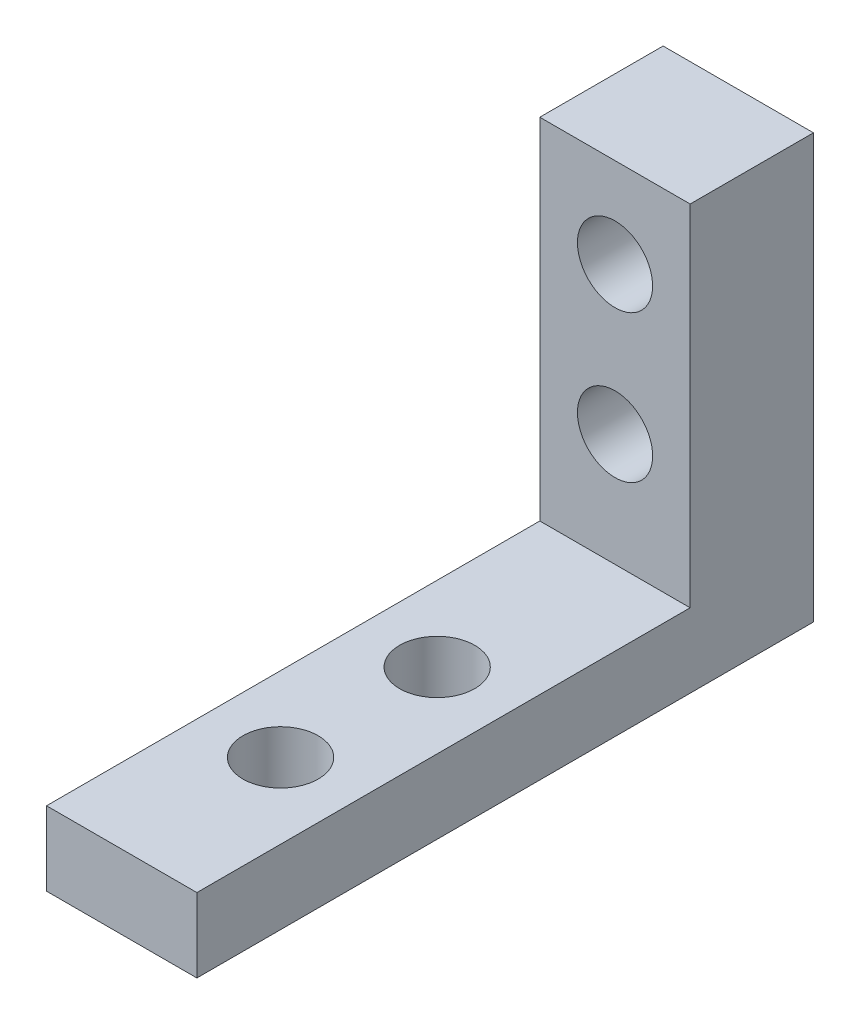
ISO-10303-21;
HEADER;
FILE_DESCRIPTION(('STEP AP214'),'2;1');
FILE_NAME('part.step','',(''),(''),'','','');
FILE_SCHEMA(('AUTOMOTIVE_DESIGN { 1 0 10303 214 1 1 1 1 }'));
ENDSEC;
DATA;
#1=APPLICATION_CONTEXT('core data for automotive mechanical design processes');
#2=APPLICATION_PROTOCOL_DEFINITION('international standard','automotive_design',2000,#1);
#3=PRODUCT_CONTEXT('',#1,'mechanical');
#4=PRODUCT('Part','Part','',(#3));
#5=PRODUCT_RELATED_PRODUCT_CATEGORY('part','',(#4));
#6=PRODUCT_DEFINITION_FORMATION('','',#4);
#7=PRODUCT_DEFINITION_CONTEXT('part definition',#1,'design');
#8=PRODUCT_DEFINITION('design','',#6,#7);
#9=PRODUCT_DEFINITION_SHAPE('','',#8);
#10=(LENGTH_UNIT() NAMED_UNIT(*) SI_UNIT(.MILLI.,.METRE.));
#11=(NAMED_UNIT(*) PLANE_ANGLE_UNIT() SI_UNIT($,.RADIAN.));
#12=(NAMED_UNIT(*) SI_UNIT($,.STERADIAN.) SOLID_ANGLE_UNIT());
#13=UNCERTAINTY_MEASURE_WITH_UNIT(LENGTH_MEASURE(1.E-05),#10,'distance_accuracy_value','');
#14=(GEOMETRIC_REPRESENTATION_CONTEXT(3) GLOBAL_UNCERTAINTY_ASSIGNED_CONTEXT((#13)) GLOBAL_UNIT_ASSIGNED_CONTEXT((#10,
#11,#12)) REPRESENTATION_CONTEXT('',''));
#15=CARTESIAN_POINT('',(0.,0.,0.));
#16=DIRECTION('',(0.,0.,1.));
#17=DIRECTION('',(1.,0.,0.));
#18=AXIS2_PLACEMENT_3D('',#15,#16,#17);
#19=CARTESIAN_POINT('',(6.096,0.,0.));
#20=DIRECTION('',(0.,-1.,0.));
#21=DIRECTION('',(0.,0.,-1.));
#22=AXIS2_PLACEMENT_3D('',#19,#20,#21);
#23=PLANE('',#22);
#24=CARTESIAN_POINT('',(3.046,0.,7.20682176459735));
#25=DIRECTION('',(0.,1.,0.));
#26=DIRECTION('',(0.,0.,1.));
#27=AXIS2_PLACEMENT_3D('',#24,#25,#26);
#28=CIRCLE('',#27,1.524);
#29=CARTESIAN_POINT('',(3.046,0.,8.73082176459736));
#30=VERTEX_POINT('',#29);
#31=EDGE_CURVE('E210',#30,#30,#28,.T.);
#32=ORIENTED_EDGE('',*,*,#31,.F.);
#33=EDGE_LOOP('',(#32));
#34=FACE_BOUND('',#33,.T.);
#35=CARTESIAN_POINT('',(3.046,0.,13.5568217645974));
#36=DIRECTION('',(0.,1.,0.));
#37=DIRECTION('',(0.,0.,1.));
#38=AXIS2_PLACEMENT_3D('',#35,#36,#37);
#39=CIRCLE('',#38,1.525);
#40=CARTESIAN_POINT('',(3.046,0.,15.0818217645974));
#41=VERTEX_POINT('',#40);
#42=EDGE_CURVE('E174',#41,#41,#39,.T.);
#43=ORIENTED_EDGE('',*,*,#42,.F.);
#44=EDGE_LOOP('',(#43));
#45=FACE_BOUND('',#44,.T.);
#46=DIRECTION('',(0.,0.,1.));
#47=VECTOR('',#46,1.);
#48=CARTESIAN_POINT('',(0.,0.,0.));
#49=LINE('',#48,#47);
#50=CARTESIAN_POINT('',(0.,0.,0.));
#51=VERTEX_POINT('',#50);
#52=CARTESIAN_POINT('',(0.,0.,20.));
#53=VERTEX_POINT('',#52);
#54=EDGE_CURVE('E130',#51,#53,#49,.T.);
#55=ORIENTED_EDGE('',*,*,#54,.T.);
#56=DIRECTION('',(-1.,0.,0.));
#57=VECTOR('',#56,1.);
#58=CARTESIAN_POINT('',(6.096,0.,20.));
#59=LINE('',#58,#57);
#60=CARTESIAN_POINT('',(6.096,0.,20.));
#61=VERTEX_POINT('',#60);
#62=EDGE_CURVE('E11',#61,#53,#59,.T.);
#63=ORIENTED_EDGE('',*,*,#62,.F.);
#64=DIRECTION('',(0.,0.,1.));
#65=VECTOR('',#64,1.);
#66=CARTESIAN_POINT('',(6.096,0.,0.));
#67=LINE('',#66,#65);
#68=CARTESIAN_POINT('',(6.096,0.,0.));
#69=VERTEX_POINT('',#68);
#70=EDGE_CURVE('E146',#69,#61,#67,.T.);
#71=ORIENTED_EDGE('',*,*,#70,.F.);
#72=DIRECTION('',(-1.,0.,0.));
#73=VECTOR('',#72,1.);
#74=CARTESIAN_POINT('',(6.096,0.,0.));
#75=LINE('',#74,#73);
#76=EDGE_CURVE('E126',#69,#51,#75,.T.);
#77=ORIENTED_EDGE('',*,*,#76,.T.);
#78=EDGE_LOOP('',(#55,#63,#71,#77));
#79=FACE_BOUND('',#78,.T.);
#80=ADVANCED_FACE('F39',(#34,#45,#79),#23,.F.);
#81=CARTESIAN_POINT('',(6.096,0.,20.));
#82=DIRECTION('',(0.,0.,-1.));
#83=DIRECTION('',(-1.,0.,0.));
#84=AXIS2_PLACEMENT_3D('',#81,#82,#83);
#85=PLANE('',#84);
#86=DIRECTION('',(0.,-1.,0.));
#87=VECTOR('',#86,1.);
#88=CARTESIAN_POINT('',(0.,0.,20.));
#89=LINE('',#88,#87);
#90=CARTESIAN_POINT('',(0.,-3.,20.));
#91=VERTEX_POINT('',#90);
#92=EDGE_CURVE('E134',#53,#91,#89,.T.);
#93=ORIENTED_EDGE('',*,*,#92,.T.);
#94=DIRECTION('',(-1.,0.,0.));
#95=VECTOR('',#94,1.);
#96=CARTESIAN_POINT('',(6.096,-3.,20.));
#97=LINE('',#96,#95);
#98=CARTESIAN_POINT('',(6.096,-3.,20.));
#99=VERTEX_POINT('',#98);
#100=EDGE_CURVE('E49',#99,#91,#97,.T.);
#101=ORIENTED_EDGE('',*,*,#100,.F.);
#102=DIRECTION('',(0.,-1.,0.));
#103=VECTOR('',#102,1.);
#104=CARTESIAN_POINT('',(6.096,0.,20.));
#105=LINE('',#104,#103);
#106=EDGE_CURVE('E95',#61,#99,#105,.T.);
#107=ORIENTED_EDGE('',*,*,#106,.F.);
#108=ORIENTED_EDGE('',*,*,#62,.T.);
#109=EDGE_LOOP('',(#93,#101,#107,#108));
#110=FACE_BOUND('',#109,.T.);
#111=ADVANCED_FACE('F183',(#110),#85,.F.);
#112=CARTESIAN_POINT('',(6.096,-3.,-5.));
#113=DIRECTION('',(0.,1.,0.));
#114=DIRECTION('',(0.,0.,1.));
#115=AXIS2_PLACEMENT_3D('',#112,#113,#114);
#116=PLANE('',#115);
#117=CARTESIAN_POINT('',(3.046,-3.,7.20682176459735));
#118=DIRECTION('',(0.,1.,0.));
#119=DIRECTION('',(0.,0.,1.));
#120=AXIS2_PLACEMENT_3D('',#117,#118,#119);
#121=CIRCLE('',#120,1.524);
#122=CARTESIAN_POINT('',(3.046,-3.,8.73082176459736));
#123=VERTEX_POINT('',#122);
#124=EDGE_CURVE('E171',#123,#123,#121,.T.);
#125=ORIENTED_EDGE('',*,*,#124,.T.);
#126=EDGE_LOOP('',(#125));
#127=FACE_BOUND('',#126,.T.);
#128=CARTESIAN_POINT('',(3.046,-3.,13.5568217645974));
#129=DIRECTION('',(0.,1.,0.));
#130=DIRECTION('',(0.,0.,1.));
#131=AXIS2_PLACEMENT_3D('',#128,#129,#130);
#132=CIRCLE('',#131,1.525);
#133=CARTESIAN_POINT('',(3.046,-3.,15.0818217645974));
#134=VERTEX_POINT('',#133);
#135=EDGE_CURVE('E215',#134,#134,#132,.T.);
#136=ORIENTED_EDGE('',*,*,#135,.T.);
#137=EDGE_LOOP('',(#136));
#138=FACE_BOUND('',#137,.T.);
#139=DIRECTION('',(0.,0.,-1.));
#140=VECTOR('',#139,1.);
#141=CARTESIAN_POINT('',(0.,-3.,-5.));
#142=LINE('',#141,#140);
#143=CARTESIAN_POINT('',(0.,-3.,-5.));
#144=VERTEX_POINT('',#143);
#145=EDGE_CURVE('E137',#91,#144,#142,.T.);
#146=ORIENTED_EDGE('',*,*,#145,.T.);
#147=DIRECTION('',(-1.,0.,0.));
#148=VECTOR('',#147,1.);
#149=CARTESIAN_POINT('',(6.096,-3.,-5.));
#150=LINE('',#149,#148);
#151=CARTESIAN_POINT('',(6.096,-3.,-5.));
#152=VERTEX_POINT('',#151);
#153=EDGE_CURVE('E119',#152,#144,#150,.T.);
#154=ORIENTED_EDGE('',*,*,#153,.F.);
#155=DIRECTION('',(0.,0.,-1.));
#156=VECTOR('',#155,1.);
#157=CARTESIAN_POINT('',(6.096,-3.,-5.));
#158=LINE('',#157,#156);
#159=EDGE_CURVE('E108',#99,#152,#158,.T.);
#160=ORIENTED_EDGE('',*,*,#159,.F.);
#161=ORIENTED_EDGE('',*,*,#100,.T.);
#162=EDGE_LOOP('',(#146,#154,#160,#161));
#163=FACE_BOUND('',#162,.T.);
#164=ADVANCED_FACE('F186',(#127,#138,#163),#116,.F.);
#165=CARTESIAN_POINT('',(6.096,14.1783216783217,-5.));
#166=DIRECTION('',(0.,0.,1.));
#167=DIRECTION('',(0.,-1.,0.));
#168=AXIS2_PLACEMENT_3D('',#165,#166,#167);
#169=PLANE('',#168);
#170=CARTESIAN_POINT('',(3.05,10.5387202913931,-5.));
#171=DIRECTION('',(0.,0.,-1.));
#172=DIRECTION('',(0.,1.,0.));
#173=AXIS2_PLACEMENT_3D('',#170,#171,#172);
#174=CIRCLE('',#173,1.524);
#175=CARTESIAN_POINT('',(3.05,12.0627202913931,-5.));
#176=VERTEX_POINT('',#175);
#177=EDGE_CURVE('E158',#176,#176,#174,.T.);
#178=ORIENTED_EDGE('',*,*,#177,.F.);
#179=EDGE_LOOP('',(#178));
#180=FACE_BOUND('',#179,.T.);
#181=CARTESIAN_POINT('',(3.05,4.57287286643293,-5.));
#182=DIRECTION('',(0.,0.,-1.));
#183=DIRECTION('',(0.,1.,0.));
#184=AXIS2_PLACEMENT_3D('',#181,#182,#183);
#185=CIRCLE('',#184,1.525);
#186=CARTESIAN_POINT('',(3.05,6.09787286643293,-5.));
#187=VERTEX_POINT('',#186);
#188=EDGE_CURVE('E165',#187,#187,#185,.T.);
#189=ORIENTED_EDGE('',*,*,#188,.F.);
#190=EDGE_LOOP('',(#189));
#191=FACE_BOUND('',#190,.T.);
#192=DIRECTION('',(0.,1.,0.));
#193=VECTOR('',#192,1.);
#194=CARTESIAN_POINT('',(0.,14.1783216783217,-5.));
#195=LINE('',#194,#193);
#196=CARTESIAN_POINT('',(0.,14.1783216783217,-5.));
#197=VERTEX_POINT('',#196);
#198=EDGE_CURVE('E117',#144,#197,#195,.T.);
#199=ORIENTED_EDGE('',*,*,#198,.T.);
#200=DIRECTION('',(-1.,0.,0.));
#201=VECTOR('',#200,1.);
#202=CARTESIAN_POINT('',(6.096,14.1783216783217,-5.));
#203=LINE('',#202,#201);
#204=CARTESIAN_POINT('',(6.096,14.1783216783217,-5.));
#205=VERTEX_POINT('',#204);
#206=EDGE_CURVE('E114',#205,#197,#203,.T.);
#207=ORIENTED_EDGE('',*,*,#206,.F.);
#208=DIRECTION('',(0.,1.,0.));
#209=VECTOR('',#208,1.);
#210=CARTESIAN_POINT('',(6.096,14.1783216783217,-5.));
#211=LINE('',#210,#209);
#212=EDGE_CURVE('E102',#152,#205,#211,.T.);
#213=ORIENTED_EDGE('',*,*,#212,.F.);
#214=ORIENTED_EDGE('',*,*,#153,.T.);
#215=EDGE_LOOP('',(#199,#207,#213,#214));
#216=FACE_BOUND('',#215,.T.);
#217=ADVANCED_FACE('F115',(#180,#191,#216),#169,.F.);
#218=CARTESIAN_POINT('',(6.096,14.1783216783217,0.));
#219=DIRECTION('',(0.,-1.,0.));
#220=DIRECTION('',(0.,0.,-1.));
#221=AXIS2_PLACEMENT_3D('',#218,#219,#220);
#222=PLANE('',#221);
#223=DIRECTION('',(0.,0.,1.));
#224=VECTOR('',#223,1.);
#225=CARTESIAN_POINT('',(0.,14.1783216783217,0.));
#226=LINE('',#225,#224);
#227=CARTESIAN_POINT('',(0.,14.1783216783217,0.));
#228=VERTEX_POINT('',#227);
#229=EDGE_CURVE('E81',#197,#228,#226,.T.);
#230=ORIENTED_EDGE('',*,*,#229,.T.);
#231=DIRECTION('',(-1.,0.,0.));
#232=VECTOR('',#231,1.);
#233=CARTESIAN_POINT('',(6.096,14.1783216783217,0.));
#234=LINE('',#233,#232);
#235=CARTESIAN_POINT('',(6.096,14.1783216783217,0.));
#236=VERTEX_POINT('',#235);
#237=EDGE_CURVE('E120',#236,#228,#234,.T.);
#238=ORIENTED_EDGE('',*,*,#237,.F.);
#239=DIRECTION('',(0.,0.,1.));
#240=VECTOR('',#239,1.);
#241=CARTESIAN_POINT('',(6.096,14.1783216783217,0.));
#242=LINE('',#241,#240);
#243=EDGE_CURVE('E106',#205,#236,#242,.T.);
#244=ORIENTED_EDGE('',*,*,#243,.F.);
#245=ORIENTED_EDGE('',*,*,#206,.T.);
#246=EDGE_LOOP('',(#230,#238,#244,#245));
#247=FACE_BOUND('',#246,.T.);
#248=ADVANCED_FACE('F122',(#247),#222,.F.);
#249=CARTESIAN_POINT('',(6.096,0.,0.));
#250=DIRECTION('',(0.,0.,-1.));
#251=DIRECTION('',(-1.,0.,0.));
#252=AXIS2_PLACEMENT_3D('',#249,#250,#251);
#253=PLANE('',#252);
#254=CARTESIAN_POINT('',(3.05,10.5387202913931,0.));
#255=DIRECTION('',(0.,0.,-1.));
#256=DIRECTION('',(-1.,0.,0.));
#257=AXIS2_PLACEMENT_3D('',#254,#255,#256);
#258=CIRCLE('',#257,1.524);
#259=CARTESIAN_POINT('',(3.05,12.0627202913931,0.));
#260=VERTEX_POINT('',#259);
#261=EDGE_CURVE('E42',#260,#260,#258,.T.);
#262=ORIENTED_EDGE('',*,*,#261,.T.);
#263=EDGE_LOOP('',(#262));
#264=FACE_BOUND('',#263,.T.);
#265=CARTESIAN_POINT('',(3.05,4.57287286643293,0.));
#266=DIRECTION('',(0.,0.,-1.));
#267=DIRECTION('',(-1.,0.,0.));
#268=AXIS2_PLACEMENT_3D('',#265,#266,#267);
#269=CIRCLE('',#268,1.525);
#270=CARTESIAN_POINT('',(3.05,6.09787286643293,0.));
#271=VERTEX_POINT('',#270);
#272=EDGE_CURVE('E155',#271,#271,#269,.T.);
#273=ORIENTED_EDGE('',*,*,#272,.T.);
#274=EDGE_LOOP('',(#273));
#275=FACE_BOUND('',#274,.T.);
#276=DIRECTION('',(0.,-1.,0.));
#277=VECTOR('',#276,1.);
#278=CARTESIAN_POINT('',(0.,0.,0.));
#279=LINE('',#278,#277);
#280=EDGE_CURVE('E87',#228,#51,#279,.T.);
#281=ORIENTED_EDGE('',*,*,#280,.T.);
#282=ORIENTED_EDGE('',*,*,#76,.F.);
#283=DIRECTION('',(0.,-1.,0.));
#284=VECTOR('',#283,1.);
#285=CARTESIAN_POINT('',(6.096,0.,0.));
#286=LINE('',#285,#284);
#287=EDGE_CURVE('E58',#236,#69,#286,.T.);
#288=ORIENTED_EDGE('',*,*,#287,.F.);
#289=ORIENTED_EDGE('',*,*,#237,.T.);
#290=EDGE_LOOP('',(#281,#282,#288,#289));
#291=FACE_BOUND('',#290,.T.);
#292=ADVANCED_FACE('F191',(#264,#275,#291),#253,.F.);
#293=CARTESIAN_POINT('',(6.096,0.,0.));
#294=DIRECTION('',(1.,0.,0.));
#295=DIRECTION('',(0.,0.,-1.));
#296=AXIS2_PLACEMENT_3D('',#293,#294,#295);
#297=PLANE('',#296);
#298=ORIENTED_EDGE('',*,*,#70,.T.);
#299=ORIENTED_EDGE('',*,*,#106,.T.);
#300=ORIENTED_EDGE('',*,*,#159,.T.);
#301=ORIENTED_EDGE('',*,*,#212,.T.);
#302=ORIENTED_EDGE('',*,*,#243,.T.);
#303=ORIENTED_EDGE('',*,*,#287,.T.);
#304=EDGE_LOOP('',(#298,#299,#300,#301,#302,#303));
#305=FACE_BOUND('',#304,.T.);
#306=ADVANCED_FACE('F104',(#305),#297,.T.);
#307=CARTESIAN_POINT('',(0.,0.,0.));
#308=DIRECTION('',(1.,0.,0.));
#309=DIRECTION('',(0.,0.,-1.));
#310=AXIS2_PLACEMENT_3D('',#307,#308,#309);
#311=PLANE('',#310);
#312=ORIENTED_EDGE('',*,*,#54,.F.);
#313=ORIENTED_EDGE('',*,*,#280,.F.);
#314=ORIENTED_EDGE('',*,*,#229,.F.);
#315=ORIENTED_EDGE('',*,*,#198,.F.);
#316=ORIENTED_EDGE('',*,*,#145,.F.);
#317=ORIENTED_EDGE('',*,*,#92,.F.);
#318=EDGE_LOOP('',(#312,#313,#314,#315,#316,#317));
#319=FACE_BOUND('',#318,.T.);
#320=ADVANCED_FACE('F189',(#319),#311,.F.);
#321=CARTESIAN_POINT('',(3.05,4.57287286643293,20.));
#322=DIRECTION('',(0.,0.,-1.));
#323=DIRECTION('',(0.,1.,0.));
#324=AXIS2_PLACEMENT_3D('',#321,#322,#323);
#325=CYLINDRICAL_SURFACE('',#324,1.525);
#326=CARTESIAN_POINT('',(3.05,6.09787286643293,-5.));
#327=CARTESIAN_POINT('',(3.05,6.09787286643293,-4.94791666666667));
#328=CARTESIAN_POINT('',(3.05,6.09787286643293,-4.89583333333333));
#329=CARTESIAN_POINT('',(3.05,6.09787286643293,-4.79166666666667));
#330=CARTESIAN_POINT('',(3.05,6.09787286643293,-4.73958333333333));
#331=CARTESIAN_POINT('',(3.05,6.09787286643293,-4.63541666666667));
#332=CARTESIAN_POINT('',(3.05,6.09787286643293,-4.58333333333333));
#333=CARTESIAN_POINT('',(3.05,6.09787286643293,-4.47916666666667));
#334=CARTESIAN_POINT('',(3.05,6.09787286643293,-4.42708333333333));
#335=CARTESIAN_POINT('',(3.05,6.09787286643293,-4.32291666666667));
#336=CARTESIAN_POINT('',(3.05,6.09787286643293,-4.27083333333333));
#337=CARTESIAN_POINT('',(3.05,6.09787286643293,-4.16666666666667));
#338=CARTESIAN_POINT('',(3.05,6.09787286643293,-4.11458333333333));
#339=CARTESIAN_POINT('',(3.05,6.09787286643293,-4.01041666666667));
#340=CARTESIAN_POINT('',(3.05,6.09787286643293,-3.95833333333333));
#341=CARTESIAN_POINT('',(3.05,6.09787286643293,-3.85416666666667));
#342=CARTESIAN_POINT('',(3.05,6.09787286643293,-3.80208333333333));
#343=CARTESIAN_POINT('',(3.05,6.09787286643293,-3.69791666666667));
#344=CARTESIAN_POINT('',(3.05,6.09787286643293,-3.64583333333333));
#345=CARTESIAN_POINT('',(3.05,6.09787286643293,-3.54166666666667));
#346=CARTESIAN_POINT('',(3.05,6.09787286643293,-3.48958333333333));
#347=CARTESIAN_POINT('',(3.05,6.09787286643293,-3.38541666666667));
#348=CARTESIAN_POINT('',(3.05,6.09787286643293,-3.33333333333333));
#349=CARTESIAN_POINT('',(3.05,6.09787286643293,-3.22916666666667));
#350=CARTESIAN_POINT('',(3.05,6.09787286643293,-3.17708333333333));
#351=CARTESIAN_POINT('',(3.05,6.09787286643293,-3.07291666666667));
#352=CARTESIAN_POINT('',(3.05,6.09787286643293,-3.02083333333333));
#353=CARTESIAN_POINT('',(3.05,6.09787286643293,-2.91666666666667));
#354=CARTESIAN_POINT('',(3.05,6.09787286643293,-2.86458333333333));
#355=CARTESIAN_POINT('',(3.05,6.09787286643293,-2.76041666666667));
#356=CARTESIAN_POINT('',(3.05,6.09787286643293,-2.70833333333333));
#357=CARTESIAN_POINT('',(3.05,6.09787286643293,-2.60416666666667));
#358=CARTESIAN_POINT('',(3.05,6.09787286643293,-2.55208333333333));
#359=CARTESIAN_POINT('',(3.05,6.09787286643293,-2.44791666666667));
#360=CARTESIAN_POINT('',(3.05,6.09787286643293,-2.39583333333333));
#361=CARTESIAN_POINT('',(3.05,6.09787286643293,-2.29166666666667));
#362=CARTESIAN_POINT('',(3.05,6.09787286643293,-2.23958333333333));
#363=CARTESIAN_POINT('',(3.05,6.09787286643293,-2.13541666666667));
#364=CARTESIAN_POINT('',(3.05,6.09787286643293,-2.08333333333333));
#365=CARTESIAN_POINT('',(3.05,6.09787286643293,-1.97916666666667));
#366=CARTESIAN_POINT('',(3.05,6.09787286643293,-1.92708333333333));
#367=CARTESIAN_POINT('',(3.05,6.09787286643293,-1.82291666666666));
#368=CARTESIAN_POINT('',(3.05,6.09787286643293,-1.77083333333333));
#369=CARTESIAN_POINT('',(3.05,6.09787286643293,-1.66666666666666));
#370=CARTESIAN_POINT('',(3.05,6.09787286643293,-1.61458333333333));
#371=CARTESIAN_POINT('',(3.05,6.09787286643293,-1.51041666666666));
#372=CARTESIAN_POINT('',(3.05,6.09787286643293,-1.45833333333333));
#373=CARTESIAN_POINT('',(3.05,6.09787286643293,-1.35416666666666));
#374=CARTESIAN_POINT('',(3.05,6.09787286643293,-1.30208333333333));
#375=CARTESIAN_POINT('',(3.05,6.09787286643293,-1.19791666666666));
#376=CARTESIAN_POINT('',(3.05,6.09787286643293,-1.14583333333333));
#377=CARTESIAN_POINT('',(3.05,6.09787286643293,-1.04166666666666));
#378=CARTESIAN_POINT('',(3.05,6.09787286643293,-0.989583333333331));
#379=CARTESIAN_POINT('',(3.05,6.09787286643293,-0.885416666666664));
#380=CARTESIAN_POINT('',(3.05,6.09787286643293,-0.833333333333331));
#381=CARTESIAN_POINT('',(3.05,6.09787286643293,-0.729166666666664));
#382=CARTESIAN_POINT('',(3.05,6.09787286643293,-0.67708333333333));
#383=CARTESIAN_POINT('',(3.05,6.09787286643293,-0.572916666666664));
#384=CARTESIAN_POINT('',(3.05,6.09787286643293,-0.52083333333333));
#385=CARTESIAN_POINT('',(3.05,6.09787286643293,-0.416666666666664));
#386=CARTESIAN_POINT('',(3.05,6.09787286643293,-0.36458333333333));
#387=CARTESIAN_POINT('',(3.05,6.09787286643293,-0.260416666666663));
#388=CARTESIAN_POINT('',(3.05,6.09787286643293,-0.20833333333333));
#389=CARTESIAN_POINT('',(3.05,6.09787286643293,-0.104166666666663));
#390=CARTESIAN_POINT('',(3.05,6.09787286643293,-0.05208333333333));
#391=CARTESIAN_POINT('',(3.05,6.09787286643293,0.));
#392=B_SPLINE_CURVE_WITH_KNOTS('',3,(#326,#327,#328,#329,#330,#331,#332,#333,#334,#335,#336,
#337,#338,#339,#340,#341,#342,#343,#344,#345,#346,#347,#348,#349,#350,#351,#352,#353,#354,#355,
#356,#357,#358,#359,#360,#361,#362,#363,#364,#365,#366,#367,#368,#369,#370,#371,#372,#373,#374,
#375,#376,#377,#378,#379,#380,#381,#382,#383,#384,#385,#386,#387,#388,#389,#390,#391),
.UNSPECIFIED.,.F.,.F.,(4,2,2,2,2,2,2,2,2,2,2,2,2,2,2,2,2,2,2,2,2,2,2,2,2,2,2,2,2,2,2,2,4),(0.,
0.15625,0.3125,0.46875,0.625000000000001,0.781250000000001,0.937500000000001,1.09375,1.25,
1.40625,1.5625,1.71875,1.875,2.03125,2.1875,2.34375,2.5,2.65625,2.8125,2.96875,3.125,3.28125,
3.4375,3.59375,3.75,3.90625,4.0625,4.21875,4.375,4.53125,4.6875,4.84375,5.),.UNSPECIFIED.);
#393=EDGE_CURVE('BSEAM242',#187,#271,#392,.T.);
#394=ORIENTED_EDGE('',*,*,#188,.T.);
#395=ORIENTED_EDGE('',*,*,#272,.F.);
#396=ORIENTED_EDGE('',*,*,#393,.T.);
#397=ORIENTED_EDGE('',*,*,#393,.F.);
#398=EDGE_LOOP('',(#394,#396,#395,#397));
#399=FACE_BOUND('',#398,.T.);
#400=ADVANCED_FACE('F242',(#399),#325,.F.);
#401=CARTESIAN_POINT('',(3.05,10.5387202913931,20.));
#402=DIRECTION('',(0.,0.,-1.));
#403=DIRECTION('',(0.,1.,0.));
#404=AXIS2_PLACEMENT_3D('',#401,#402,#403);
#405=CYLINDRICAL_SURFACE('',#404,1.524);
#406=CARTESIAN_POINT('',(3.05,12.0627202913931,-5.));
#407=CARTESIAN_POINT('',(3.05,12.0627202913931,-4.94791666666667));
#408=CARTESIAN_POINT('',(3.05,12.0627202913931,-4.89583333333333));
#409=CARTESIAN_POINT('',(3.05,12.0627202913931,-4.79166666666667));
#410=CARTESIAN_POINT('',(3.05,12.0627202913931,-4.73958333333333));
#411=CARTESIAN_POINT('',(3.05,12.0627202913931,-4.63541666666667));
#412=CARTESIAN_POINT('',(3.05,12.0627202913931,-4.58333333333333));
#413=CARTESIAN_POINT('',(3.05,12.0627202913931,-4.47916666666667));
#414=CARTESIAN_POINT('',(3.05,12.0627202913931,-4.42708333333333));
#415=CARTESIAN_POINT('',(3.05,12.0627202913931,-4.32291666666667));
#416=CARTESIAN_POINT('',(3.05,12.0627202913931,-4.27083333333333));
#417=CARTESIAN_POINT('',(3.05,12.0627202913931,-4.16666666666667));
#418=CARTESIAN_POINT('',(3.05,12.0627202913931,-4.11458333333333));
#419=CARTESIAN_POINT('',(3.05,12.0627202913931,-4.01041666666667));
#420=CARTESIAN_POINT('',(3.05,12.0627202913931,-3.95833333333333));
#421=CARTESIAN_POINT('',(3.05,12.0627202913931,-3.85416666666667));
#422=CARTESIAN_POINT('',(3.05,12.0627202913931,-3.80208333333333));
#423=CARTESIAN_POINT('',(3.05,12.0627202913931,-3.69791666666667));
#424=CARTESIAN_POINT('',(3.05,12.0627202913931,-3.64583333333333));
#425=CARTESIAN_POINT('',(3.05,12.0627202913931,-3.54166666666667));
#426=CARTESIAN_POINT('',(3.05,12.0627202913931,-3.48958333333333));
#427=CARTESIAN_POINT('',(3.05,12.0627202913931,-3.38541666666667));
#428=CARTESIAN_POINT('',(3.05,12.0627202913931,-3.33333333333333));
#429=CARTESIAN_POINT('',(3.05,12.0627202913931,-3.22916666666667));
#430=CARTESIAN_POINT('',(3.05,12.0627202913931,-3.17708333333333));
#431=CARTESIAN_POINT('',(3.05,12.0627202913931,-3.07291666666667));
#432=CARTESIAN_POINT('',(3.05,12.0627202913931,-3.02083333333333));
#433=CARTESIAN_POINT('',(3.05,12.0627202913931,-2.91666666666667));
#434=CARTESIAN_POINT('',(3.05,12.0627202913931,-2.86458333333333));
#435=CARTESIAN_POINT('',(3.05,12.0627202913931,-2.76041666666667));
#436=CARTESIAN_POINT('',(3.05,12.0627202913931,-2.70833333333333));
#437=CARTESIAN_POINT('',(3.05,12.0627202913931,-2.60416666666667));
#438=CARTESIAN_POINT('',(3.05,12.0627202913931,-2.55208333333333));
#439=CARTESIAN_POINT('',(3.05,12.0627202913931,-2.44791666666667));
#440=CARTESIAN_POINT('',(3.05,12.0627202913931,-2.39583333333333));
#441=CARTESIAN_POINT('',(3.05,12.0627202913931,-2.29166666666667));
#442=CARTESIAN_POINT('',(3.05,12.0627202913931,-2.23958333333333));
#443=CARTESIAN_POINT('',(3.05,12.0627202913931,-2.13541666666667));
#444=CARTESIAN_POINT('',(3.05,12.0627202913931,-2.08333333333333));
#445=CARTESIAN_POINT('',(3.05,12.0627202913931,-1.97916666666667));
#446=CARTESIAN_POINT('',(3.05,12.0627202913931,-1.92708333333333));
#447=CARTESIAN_POINT('',(3.05,12.0627202913931,-1.82291666666666));
#448=CARTESIAN_POINT('',(3.05,12.0627202913931,-1.77083333333333));
#449=CARTESIAN_POINT('',(3.05,12.0627202913931,-1.66666666666666));
#450=CARTESIAN_POINT('',(3.05,12.0627202913931,-1.61458333333333));
#451=CARTESIAN_POINT('',(3.05,12.0627202913931,-1.51041666666666));
#452=CARTESIAN_POINT('',(3.05,12.0627202913931,-1.45833333333333));
#453=CARTESIAN_POINT('',(3.05,12.0627202913931,-1.35416666666666));
#454=CARTESIAN_POINT('',(3.05,12.0627202913931,-1.30208333333333));
#455=CARTESIAN_POINT('',(3.05,12.0627202913931,-1.19791666666666));
#456=CARTESIAN_POINT('',(3.05,12.0627202913931,-1.14583333333333));
#457=CARTESIAN_POINT('',(3.05,12.0627202913931,-1.04166666666666));
#458=CARTESIAN_POINT('',(3.05,12.0627202913931,-0.989583333333331));
#459=CARTESIAN_POINT('',(3.05,12.0627202913931,-0.885416666666664));
#460=CARTESIAN_POINT('',(3.05,12.0627202913931,-0.833333333333331));
#461=CARTESIAN_POINT('',(3.05,12.0627202913931,-0.729166666666664));
#462=CARTESIAN_POINT('',(3.05,12.0627202913931,-0.67708333333333));
#463=CARTESIAN_POINT('',(3.05,12.0627202913931,-0.572916666666664));
#464=CARTESIAN_POINT('',(3.05,12.0627202913931,-0.52083333333333));
#465=CARTESIAN_POINT('',(3.05,12.0627202913931,-0.416666666666664));
#466=CARTESIAN_POINT('',(3.05,12.0627202913931,-0.36458333333333));
#467=CARTESIAN_POINT('',(3.05,12.0627202913931,-0.260416666666663));
#468=CARTESIAN_POINT('',(3.05,12.0627202913931,-0.20833333333333));
#469=CARTESIAN_POINT('',(3.05,12.0627202913931,-0.104166666666663));
#470=CARTESIAN_POINT('',(3.05,12.0627202913931,-0.05208333333333));
#471=CARTESIAN_POINT('',(3.05,12.0627202913931,0.));
#472=B_SPLINE_CURVE_WITH_KNOTS('',3,(#406,#407,#408,#409,#410,#411,#412,#413,#414,#415,#416,
#417,#418,#419,#420,#421,#422,#423,#424,#425,#426,#427,#428,#429,#430,#431,#432,#433,#434,#435,
#436,#437,#438,#439,#440,#441,#442,#443,#444,#445,#446,#447,#448,#449,#450,#451,#452,#453,#454,
#455,#456,#457,#458,#459,#460,#461,#462,#463,#464,#465,#466,#467,#468,#469,#470,#471),
.UNSPECIFIED.,.F.,.F.,(4,2,2,2,2,2,2,2,2,2,2,2,2,2,2,2,2,2,2,2,2,2,2,2,2,2,2,2,2,2,2,2,4),(0.,
0.15625,0.3125,0.46875,0.625000000000001,0.781250000000001,0.937500000000001,1.09375,1.25,
1.40625,1.5625,1.71875,1.875,2.03125,2.1875,2.34375,2.5,2.65625,2.8125,2.96875,3.125,3.28125,
3.4375,3.59375,3.75,3.90625,4.0625,4.21875,4.375,4.53125,4.6875,4.84375,5.),.UNSPECIFIED.);
#473=EDGE_CURVE('BSEAM236',#176,#260,#472,.T.);
#474=ORIENTED_EDGE('',*,*,#177,.T.);
#475=ORIENTED_EDGE('',*,*,#261,.F.);
#476=ORIENTED_EDGE('',*,*,#473,.T.);
#477=ORIENTED_EDGE('',*,*,#473,.F.);
#478=EDGE_LOOP('',(#474,#476,#475,#477));
#479=FACE_BOUND('',#478,.T.);
#480=ADVANCED_FACE('F236',(#479),#405,.F.);
#481=CARTESIAN_POINT('',(3.046,-3.,13.5568217645974));
#482=DIRECTION('',(0.,1.,0.));
#483=DIRECTION('',(0.,0.,1.));
#484=AXIS2_PLACEMENT_3D('',#481,#482,#483);
#485=CYLINDRICAL_SURFACE('',#484,1.525);
#486=ORIENTED_EDGE('',*,*,#135,.F.);
#487=EDGE_LOOP('',(#486));
#488=FACE_BOUND('',#487,.T.);
#489=ORIENTED_EDGE('',*,*,#42,.T.);
#490=EDGE_LOOP('',(#489));
#491=FACE_BOUND('',#490,.T.);
#492=ADVANCED_FACE('F231',(#488,#491),#485,.F.);
#493=CARTESIAN_POINT('',(3.046,-3.,7.20682176459735));
#494=DIRECTION('',(0.,1.,0.));
#495=DIRECTION('',(0.,0.,1.));
#496=AXIS2_PLACEMENT_3D('',#493,#494,#495);
#497=CYLINDRICAL_SURFACE('',#496,1.524);
#498=ORIENTED_EDGE('',*,*,#124,.F.);
#499=EDGE_LOOP('',(#498));
#500=FACE_BOUND('',#499,.T.);
#501=ORIENTED_EDGE('',*,*,#31,.T.);
#502=EDGE_LOOP('',(#501));
#503=FACE_BOUND('',#502,.T.);
#504=ADVANCED_FACE('F228',(#500,#503),#497,.F.);
#505=CLOSED_SHELL('',(#80,#111,#164,#217,#248,#292,#306,#320,#400,#480,#492,#504));
#506=MANIFOLD_SOLID_BREP('B2',#505);
#507=ADVANCED_BREP_SHAPE_REPRESENTATION('',(#18,#506),#14);
#508=SHAPE_DEFINITION_REPRESENTATION(#9,#507);
ENDSEC;
END-ISO-10303-21;
